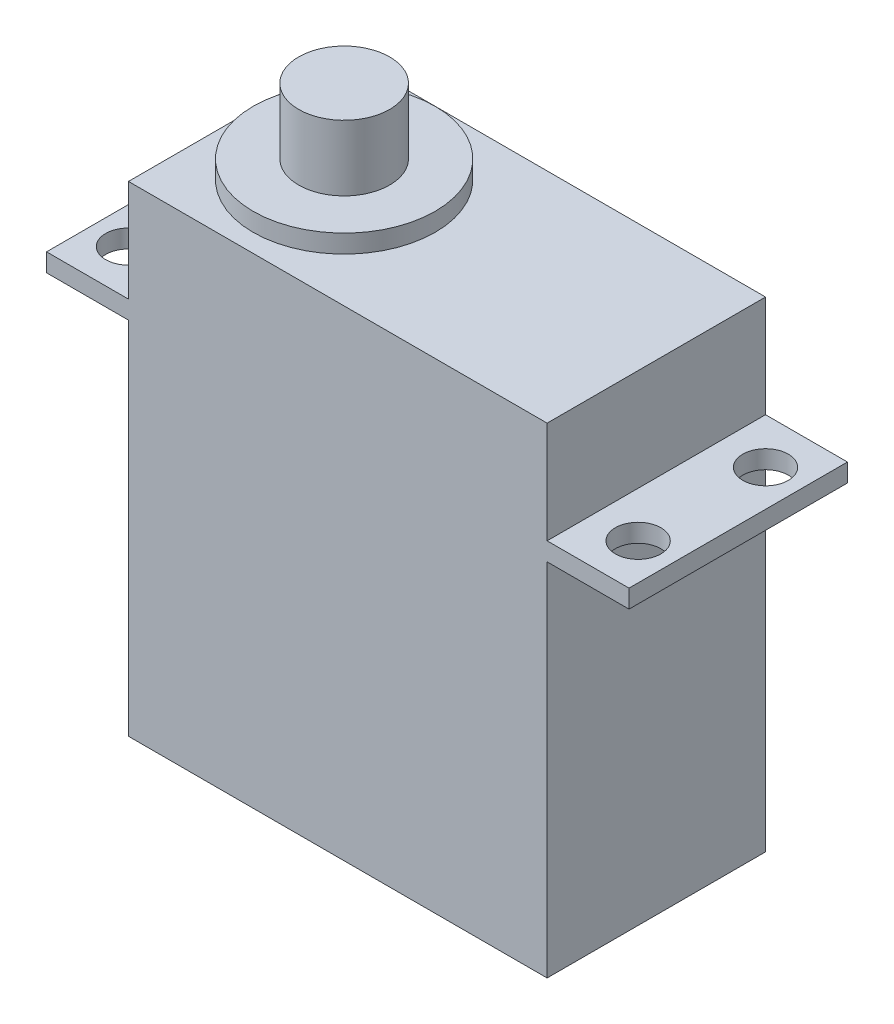
ISO-10303-21;
HEADER;
FILE_DESCRIPTION(('STEP AP214'),'2;1');
FILE_NAME('part.step','',(''),(''),'','','');
FILE_SCHEMA(('AUTOMOTIVE_DESIGN { 1 0 10303 214 1 1 1 1 }'));
ENDSEC;
DATA;
#1=APPLICATION_CONTEXT('core data for automotive mechanical design processes');
#2=APPLICATION_PROTOCOL_DEFINITION('international standard','automotive_design',2000,#1);
#3=PRODUCT_CONTEXT('',#1,'mechanical');
#4=PRODUCT('Part','Part','',(#3));
#5=PRODUCT_RELATED_PRODUCT_CATEGORY('part','',(#4));
#6=PRODUCT_DEFINITION_FORMATION('','',#4);
#7=PRODUCT_DEFINITION_CONTEXT('part definition',#1,'design');
#8=PRODUCT_DEFINITION('design','',#6,#7);
#9=PRODUCT_DEFINITION_SHAPE('','',#8);
#10=(LENGTH_UNIT() NAMED_UNIT(*) SI_UNIT(.MILLI.,.METRE.));
#11=(NAMED_UNIT(*) PLANE_ANGLE_UNIT() SI_UNIT($,.RADIAN.));
#12=(NAMED_UNIT(*) SI_UNIT($,.STERADIAN.) SOLID_ANGLE_UNIT());
#13=UNCERTAINTY_MEASURE_WITH_UNIT(LENGTH_MEASURE(1.E-05),#10,'distance_accuracy_value','');
#14=(GEOMETRIC_REPRESENTATION_CONTEXT(3) GLOBAL_UNCERTAINTY_ASSIGNED_CONTEXT((#13)) GLOBAL_UNIT_ASSIGNED_CONTEXT((#10,
#11,#12)) REPRESENTATION_CONTEXT('',''));
#15=CARTESIAN_POINT('',(0.,0.,0.));
#16=DIRECTION('',(0.,0.,1.));
#17=DIRECTION('',(1.,0.,0.));
#18=AXIS2_PLACEMENT_3D('',#15,#16,#17);
#19=CARTESIAN_POINT('',(-11.5,-19.8,0.));
#20=DIRECTION('',(1.,0.,0.));
#21=DIRECTION('',(0.,0.,-1.));
#22=AXIS2_PLACEMENT_3D('',#19,#20,#21);
#23=PLANE('',#22);
#24=DIRECTION('',(0.,0.,-1.));
#25=VECTOR('',#24,1.);
#26=CARTESIAN_POINT('',(-11.5,1.,0.));
#27=LINE('',#26,#25);
#28=CARTESIAN_POINT('',(-11.5,0.999999999999994,6.));
#29=VERTEX_POINT('',#28);
#30=CARTESIAN_POINT('',(-11.5,1.,-6.));
#31=VERTEX_POINT('',#30);
#32=EDGE_CURVE('E65',#29,#31,#27,.T.);
#33=ORIENTED_EDGE('',*,*,#32,.F.);
#34=DIRECTION('',(0.,1.,0.));
#35=VECTOR('',#34,1.);
#36=CARTESIAN_POINT('',(-11.5,-19.8,6.));
#37=LINE('',#36,#35);
#38=CARTESIAN_POINT('',(-11.5,6.6,6.));
#39=VERTEX_POINT('',#38);
#40=EDGE_CURVE('E232',#29,#39,#37,.T.);
#41=ORIENTED_EDGE('',*,*,#40,.T.);
#42=DIRECTION('',(0.,0.,-1.));
#43=VECTOR('',#42,1.);
#44=CARTESIAN_POINT('',(-11.5,6.6,0.));
#45=LINE('',#44,#43);
#46=CARTESIAN_POINT('',(-11.5,6.6,-6.));
#47=VERTEX_POINT('',#46);
#48=EDGE_CURVE('E131',#39,#47,#45,.T.);
#49=ORIENTED_EDGE('',*,*,#48,.T.);
#50=DIRECTION('',(0.,1.,0.));
#51=VECTOR('',#50,1.);
#52=CARTESIAN_POINT('',(-11.5,-19.8,-6.));
#53=LINE('',#52,#51);
#54=EDGE_CURVE('E50',#31,#47,#53,.T.);
#55=ORIENTED_EDGE('',*,*,#54,.F.);
#56=EDGE_LOOP('',(#33,#41,#49,#55));
#57=FACE_BOUND('',#56,.T.);
#58=ADVANCED_FACE('F41',(#57),#23,.F.);
#59=CARTESIAN_POINT('',(11.5,-19.8,0.));
#60=DIRECTION('',(1.,0.,0.));
#61=DIRECTION('',(0.,0.,-1.));
#62=AXIS2_PLACEMENT_3D('',#59,#60,#61);
#63=PLANE('',#62);
#64=DIRECTION('',(0.,1.,0.));
#65=VECTOR('',#64,1.);
#66=CARTESIAN_POINT('',(11.5,-19.8,6.));
#67=LINE('',#66,#65);
#68=CARTESIAN_POINT('',(11.5,1.,6.));
#69=VERTEX_POINT('',#68);
#70=CARTESIAN_POINT('',(11.5,6.6,6.));
#71=VERTEX_POINT('',#70);
#72=EDGE_CURVE('E239',#69,#71,#67,.T.);
#73=ORIENTED_EDGE('',*,*,#72,.F.);
#74=DIRECTION('',(0.,0.,-1.));
#75=VECTOR('',#74,1.);
#76=CARTESIAN_POINT('',(11.5,1.,0.));
#77=LINE('',#76,#75);
#78=CARTESIAN_POINT('',(11.5,0.999999999999994,-6.));
#79=VERTEX_POINT('',#78);
#80=EDGE_CURVE('E183',#69,#79,#77,.T.);
#81=ORIENTED_EDGE('',*,*,#80,.T.);
#82=DIRECTION('',(0.,1.,0.));
#83=VECTOR('',#82,1.);
#84=CARTESIAN_POINT('',(11.5,-19.8,-6.));
#85=LINE('',#84,#83);
#86=CARTESIAN_POINT('',(11.5,6.6,-6.));
#87=VERTEX_POINT('',#86);
#88=EDGE_CURVE('E236',#79,#87,#85,.T.);
#89=ORIENTED_EDGE('',*,*,#88,.T.);
#90=DIRECTION('',(0.,0.,-1.));
#91=VECTOR('',#90,1.);
#92=CARTESIAN_POINT('',(11.5,6.6,0.));
#93=LINE('',#92,#91);
#94=EDGE_CURVE('E217',#71,#87,#93,.T.);
#95=ORIENTED_EDGE('',*,*,#94,.F.);
#96=EDGE_LOOP('',(#73,#81,#89,#95));
#97=FACE_BOUND('',#96,.T.);
#98=ADVANCED_FACE('F251',(#97),#63,.T.);
#99=CARTESIAN_POINT('',(-11.5,-19.8,6.));
#100=VERTEX_POINT('',#99);
#101=CARTESIAN_POINT('',(-11.5,0.,6.));
#102=VERTEX_POINT('',#101);
#103=EDGE_CURVE('E240',#100,#102,#37,.T.);
#104=ORIENTED_EDGE('',*,*,#103,.T.);
#105=DIRECTION('',(0.,0.,-1.));
#106=VECTOR('',#105,1.);
#107=CARTESIAN_POINT('',(-11.5,0.,0.));
#108=LINE('',#107,#106);
#109=CARTESIAN_POINT('',(-11.5,0.,-6.));
#110=VERTEX_POINT('',#109);
#111=EDGE_CURVE('E58',#102,#110,#108,.T.);
#112=ORIENTED_EDGE('',*,*,#111,.T.);
#113=CARTESIAN_POINT('',(-11.5,-19.8,-6.));
#114=VERTEX_POINT('',#113);
#115=EDGE_CURVE('E11',#114,#110,#53,.T.);
#116=ORIENTED_EDGE('',*,*,#115,.F.);
#117=DIRECTION('',(0.,0.,-1.));
#118=VECTOR('',#117,1.);
#119=CARTESIAN_POINT('',(-11.5,-19.8,0.));
#120=LINE('',#119,#118);
#121=EDGE_CURVE('E222',#100,#114,#120,.T.);
#122=ORIENTED_EDGE('',*,*,#121,.F.);
#123=EDGE_LOOP('',(#104,#112,#116,#122));
#124=FACE_BOUND('',#123,.T.);
#125=ADVANCED_FACE('F43',(#124),#23,.F.);
#126=CARTESIAN_POINT('',(0.,-19.8,-6.));
#127=DIRECTION('',(0.,0.,1.));
#128=DIRECTION('',(1.,0.,0.));
#129=AXIS2_PLACEMENT_3D('',#126,#127,#128);
#130=PLANE('',#129);
#131=ORIENTED_EDGE('',*,*,#115,.T.);
#132=DIRECTION('',(1.,0.,0.));
#133=VECTOR('',#132,1.);
#134=CARTESIAN_POINT('',(0.,0.,-6.));
#135=LINE('',#134,#133);
#136=CARTESIAN_POINT('',(-16.,0.,-6.));
#137=VERTEX_POINT('',#136);
#138=EDGE_CURVE('E166',#137,#110,#135,.T.);
#139=ORIENTED_EDGE('',*,*,#138,.F.);
#140=DIRECTION('',(0.,-1.,0.));
#141=VECTOR('',#140,1.);
#142=CARTESIAN_POINT('',(-16.,1.,-6.));
#143=LINE('',#142,#141);
#144=CARTESIAN_POINT('',(-16.,1.,-6.));
#145=VERTEX_POINT('',#144);
#146=EDGE_CURVE('E147',#145,#137,#143,.T.);
#147=ORIENTED_EDGE('',*,*,#146,.F.);
#148=DIRECTION('',(1.,0.,0.));
#149=VECTOR('',#148,1.);
#150=CARTESIAN_POINT('',(0.,1.,-6.));
#151=LINE('',#150,#149);
#152=EDGE_CURVE('E141',#145,#31,#151,.T.);
#153=ORIENTED_EDGE('',*,*,#152,.T.);
#154=ORIENTED_EDGE('',*,*,#54,.T.);
#155=DIRECTION('',(1.,0.,0.));
#156=VECTOR('',#155,1.);
#157=CARTESIAN_POINT('',(0.,6.6,-6.));
#158=LINE('',#157,#156);
#159=EDGE_CURVE('E220',#47,#87,#158,.T.);
#160=ORIENTED_EDGE('',*,*,#159,.T.);
#161=ORIENTED_EDGE('',*,*,#88,.F.);
#162=DIRECTION('',(1.,0.,0.));
#163=VECTOR('',#162,1.);
#164=CARTESIAN_POINT('',(0.,1.,-6.));
#165=LINE('',#164,#163);
#166=CARTESIAN_POINT('',(16.,1.,-6.));
#167=VERTEX_POINT('',#166);
#168=EDGE_CURVE('E191',#79,#167,#165,.T.);
#169=ORIENTED_EDGE('',*,*,#168,.T.);
#170=DIRECTION('',(0.,-1.,0.));
#171=VECTOR('',#170,1.);
#172=CARTESIAN_POINT('',(16.,1.,-6.));
#173=LINE('',#172,#171);
#174=CARTESIAN_POINT('',(16.,0.,-6.));
#175=VERTEX_POINT('',#174);
#176=EDGE_CURVE('E194',#167,#175,#173,.T.);
#177=ORIENTED_EDGE('',*,*,#176,.T.);
#178=DIRECTION('',(1.,0.,0.));
#179=VECTOR('',#178,1.);
#180=CARTESIAN_POINT('',(0.,0.,-6.));
#181=LINE('',#180,#179);
#182=CARTESIAN_POINT('',(11.5,0.,-6.));
#183=VERTEX_POINT('',#182);
#184=EDGE_CURVE('E180',#183,#175,#181,.T.);
#185=ORIENTED_EDGE('',*,*,#184,.F.);
#186=CARTESIAN_POINT('',(11.5,-19.8,-6.));
#187=VERTEX_POINT('',#186);
#188=EDGE_CURVE('E136',#187,#183,#85,.T.);
#189=ORIENTED_EDGE('',*,*,#188,.F.);
#190=DIRECTION('',(1.,0.,0.));
#191=VECTOR('',#190,1.);
#192=CARTESIAN_POINT('',(0.,-19.8,-6.));
#193=LINE('',#192,#191);
#194=EDGE_CURVE('E231',#114,#187,#193,.T.);
#195=ORIENTED_EDGE('',*,*,#194,.F.);
#196=EDGE_LOOP('',(#131,#139,#147,#153,#154,#160,#161,#169,#177,#185,#189,#195));
#197=FACE_BOUND('',#196,.T.);
#198=ADVANCED_FACE('F145',(#197),#130,.F.);
#199=DIRECTION('',(0.,0.,-1.));
#200=VECTOR('',#199,1.);
#201=CARTESIAN_POINT('',(11.5,0.,0.));
#202=LINE('',#201,#200);
#203=CARTESIAN_POINT('',(11.5,0.,6.));
#204=VERTEX_POINT('',#203);
#205=EDGE_CURVE('E200',#204,#183,#202,.T.);
#206=ORIENTED_EDGE('',*,*,#205,.F.);
#207=CARTESIAN_POINT('',(11.5,-19.8,6.));
#208=VERTEX_POINT('',#207);
#209=EDGE_CURVE('E237',#208,#204,#67,.T.);
#210=ORIENTED_EDGE('',*,*,#209,.F.);
#211=DIRECTION('',(0.,0.,-1.));
#212=VECTOR('',#211,1.);
#213=CARTESIAN_POINT('',(11.5,-19.8,0.));
#214=LINE('',#213,#212);
#215=EDGE_CURVE('E228',#208,#187,#214,.T.);
#216=ORIENTED_EDGE('',*,*,#215,.T.);
#217=ORIENTED_EDGE('',*,*,#188,.T.);
#218=EDGE_LOOP('',(#206,#210,#216,#217));
#219=FACE_BOUND('',#218,.T.);
#220=ADVANCED_FACE('F265',(#219),#63,.T.);
#221=CARTESIAN_POINT('',(0.,-19.8,6.));
#222=DIRECTION('',(0.,0.,1.));
#223=DIRECTION('',(1.,0.,0.));
#224=AXIS2_PLACEMENT_3D('',#221,#222,#223);
#225=PLANE('',#224);
#226=ORIENTED_EDGE('',*,*,#209,.T.);
#227=DIRECTION('',(1.,0.,0.));
#228=VECTOR('',#227,1.);
#229=CARTESIAN_POINT('',(0.,0.,6.));
#230=LINE('',#229,#228);
#231=CARTESIAN_POINT('',(16.,0.,6.));
#232=VERTEX_POINT('',#231);
#233=EDGE_CURVE('E202',#204,#232,#230,.T.);
#234=ORIENTED_EDGE('',*,*,#233,.T.);
#235=DIRECTION('',(0.,-1.,0.));
#236=VECTOR('',#235,1.);
#237=CARTESIAN_POINT('',(16.,1.,6.));
#238=LINE('',#237,#236);
#239=CARTESIAN_POINT('',(16.,1.,6.));
#240=VERTEX_POINT('',#239);
#241=EDGE_CURVE('E211',#240,#232,#238,.T.);
#242=ORIENTED_EDGE('',*,*,#241,.F.);
#243=DIRECTION('',(1.,0.,0.));
#244=VECTOR('',#243,1.);
#245=CARTESIAN_POINT('',(0.,1.,6.));
#246=LINE('',#245,#244);
#247=EDGE_CURVE('E186',#69,#240,#246,.T.);
#248=ORIENTED_EDGE('',*,*,#247,.F.);
#249=ORIENTED_EDGE('',*,*,#72,.T.);
#250=DIRECTION('',(1.,0.,0.));
#251=VECTOR('',#250,1.);
#252=CARTESIAN_POINT('',(0.,6.6,6.));
#253=LINE('',#252,#251);
#254=EDGE_CURVE('E214',#39,#71,#253,.T.);
#255=ORIENTED_EDGE('',*,*,#254,.F.);
#256=ORIENTED_EDGE('',*,*,#40,.F.);
#257=DIRECTION('',(1.,0.,0.));
#258=VECTOR('',#257,1.);
#259=CARTESIAN_POINT('',(0.,1.,6.));
#260=LINE('',#259,#258);
#261=CARTESIAN_POINT('',(-16.,1.,6.));
#262=VERTEX_POINT('',#261);
#263=EDGE_CURVE('E143',#262,#29,#260,.T.);
#264=ORIENTED_EDGE('',*,*,#263,.F.);
#265=DIRECTION('',(0.,-1.,0.));
#266=VECTOR('',#265,1.);
#267=CARTESIAN_POINT('',(-16.,1.,6.));
#268=LINE('',#267,#266);
#269=CARTESIAN_POINT('',(-16.,0.,6.));
#270=VERTEX_POINT('',#269);
#271=EDGE_CURVE('E151',#262,#270,#268,.T.);
#272=ORIENTED_EDGE('',*,*,#271,.T.);
#273=DIRECTION('',(1.,0.,0.));
#274=VECTOR('',#273,1.);
#275=CARTESIAN_POINT('',(0.,0.,6.));
#276=LINE('',#275,#274);
#277=EDGE_CURVE('E162',#270,#102,#276,.T.);
#278=ORIENTED_EDGE('',*,*,#277,.T.);
#279=ORIENTED_EDGE('',*,*,#103,.F.);
#280=DIRECTION('',(1.,0.,0.));
#281=VECTOR('',#280,1.);
#282=CARTESIAN_POINT('',(0.,-19.8,6.));
#283=LINE('',#282,#281);
#284=EDGE_CURVE('E225',#100,#208,#283,.T.);
#285=ORIENTED_EDGE('',*,*,#284,.T.);
#286=EDGE_LOOP('',(#226,#234,#242,#248,#249,#255,#256,#264,#272,#278,#279,#285));
#287=FACE_BOUND('',#286,.T.);
#288=ADVANCED_FACE('F244',(#287),#225,.T.);
#289=CARTESIAN_POINT('',(0.,-19.8,0.));
#290=DIRECTION('',(0.,1.,0.));
#291=DIRECTION('',(0.,0.,1.));
#292=AXIS2_PLACEMENT_3D('',#289,#290,#291);
#293=PLANE('',#292);
#294=ORIENTED_EDGE('',*,*,#121,.T.);
#295=ORIENTED_EDGE('',*,*,#194,.T.);
#296=ORIENTED_EDGE('',*,*,#215,.F.);
#297=ORIENTED_EDGE('',*,*,#284,.F.);
#298=EDGE_LOOP('',(#294,#295,#296,#297));
#299=FACE_BOUND('',#298,.T.);
#300=ADVANCED_FACE('F269',(#299),#293,.F.);
#301=CARTESIAN_POINT('',(0.,6.6,0.));
#302=DIRECTION('',(0.,1.,0.));
#303=DIRECTION('',(0.,0.,1.));
#304=AXIS2_PLACEMENT_3D('',#301,#302,#303);
#305=PLANE('',#304);
#306=CARTESIAN_POINT('',(-5.65,6.6,0.));
#307=DIRECTION('',(0.,1.,0.));
#308=DIRECTION('',(0.,0.,1.));
#309=AXIS2_PLACEMENT_3D('',#306,#307,#308);
#310=CIRCLE('',#309,5.);
#311=CARTESIAN_POINT('',(-5.65,6.6,5.));
#312=VERTEX_POINT('',#311);
#313=EDGE_CURVE('E285',#312,#312,#310,.T.);
#314=ORIENTED_EDGE('',*,*,#313,.F.);
#315=EDGE_LOOP('',(#314));
#316=FACE_BOUND('',#315,.T.);
#317=ORIENTED_EDGE('',*,*,#48,.F.);
#318=ORIENTED_EDGE('',*,*,#254,.T.);
#319=ORIENTED_EDGE('',*,*,#94,.T.);
#320=ORIENTED_EDGE('',*,*,#159,.F.);
#321=EDGE_LOOP('',(#317,#318,#319,#320));
#322=FACE_BOUND('',#321,.T.);
#323=ADVANCED_FACE('F248',(#316,#322),#305,.T.);
#324=CARTESIAN_POINT('',(16.,1.,0.));
#325=DIRECTION('',(1.,0.,0.));
#326=DIRECTION('',(0.,0.,-1.));
#327=AXIS2_PLACEMENT_3D('',#324,#325,#326);
#328=PLANE('',#327);
#329=DIRECTION('',(0.,0.,1.));
#330=VECTOR('',#329,1.);
#331=CARTESIAN_POINT('',(16.,0.,0.));
#332=LINE('',#331,#330);
#333=EDGE_CURVE('E205',#175,#232,#332,.T.);
#334=ORIENTED_EDGE('',*,*,#333,.F.);
#335=ORIENTED_EDGE('',*,*,#176,.F.);
#336=DIRECTION('',(0.,0.,1.));
#337=VECTOR('',#336,1.);
#338=CARTESIAN_POINT('',(16.,1.,0.));
#339=LINE('',#338,#337);
#340=EDGE_CURVE('E188',#167,#240,#339,.T.);
#341=ORIENTED_EDGE('',*,*,#340,.T.);
#342=ORIENTED_EDGE('',*,*,#241,.T.);
#343=EDGE_LOOP('',(#334,#335,#341,#342));
#344=FACE_BOUND('',#343,.T.);
#345=ADVANCED_FACE('F259',(#344),#328,.T.);
#346=CARTESIAN_POINT('',(14.,1.,-3.5));
#347=DIRECTION('',(0.,-1.,0.));
#348=DIRECTION('',(0.,0.,-1.));
#349=AXIS2_PLACEMENT_3D('',#346,#347,#348);
#350=CYLINDRICAL_SURFACE('',#349,1.25);
#351=CARTESIAN_POINT('',(14.,1.,-3.5));
#352=DIRECTION('',(0.,1.,0.));
#353=DIRECTION('',(0.,0.,1.));
#354=AXIS2_PLACEMENT_3D('',#351,#352,#353);
#355=CIRCLE('',#354,1.25);
#356=CARTESIAN_POINT('',(14.,1.,-2.25));
#357=VERTEX_POINT('',#356);
#358=EDGE_CURVE('E179',#357,#357,#355,.T.);
#359=ORIENTED_EDGE('',*,*,#358,.T.);
#360=EDGE_LOOP('',(#359));
#361=FACE_BOUND('',#360,.T.);
#362=CARTESIAN_POINT('',(14.,0.,-3.5));
#363=DIRECTION('',(0.,1.,0.));
#364=DIRECTION('',(0.,0.,1.));
#365=AXIS2_PLACEMENT_3D('',#362,#363,#364);
#366=CIRCLE('',#365,1.25);
#367=CARTESIAN_POINT('',(14.,0.,-2.25));
#368=VERTEX_POINT('',#367);
#369=EDGE_CURVE('E197',#368,#368,#366,.T.);
#370=ORIENTED_EDGE('',*,*,#369,.F.);
#371=EDGE_LOOP('',(#370));
#372=FACE_BOUND('',#371,.T.);
#373=ADVANCED_FACE('F337',(#361,#372),#350,.F.);
#374=CARTESIAN_POINT('',(14.,1.,3.5));
#375=DIRECTION('',(0.,-1.,0.));
#376=DIRECTION('',(0.,0.,-1.));
#377=AXIS2_PLACEMENT_3D('',#374,#375,#376);
#378=CYLINDRICAL_SURFACE('',#377,1.25);
#379=CARTESIAN_POINT('',(14.,1.,3.5));
#380=DIRECTION('',(0.,1.,0.));
#381=DIRECTION('',(0.,0.,1.));
#382=AXIS2_PLACEMENT_3D('',#379,#380,#381);
#383=CIRCLE('',#382,1.25);
#384=CARTESIAN_POINT('',(14.,1.,4.74999999999999));
#385=VERTEX_POINT('',#384);
#386=EDGE_CURVE('E176',#385,#385,#383,.T.);
#387=ORIENTED_EDGE('',*,*,#386,.T.);
#388=EDGE_LOOP('',(#387));
#389=FACE_BOUND('',#388,.T.);
#390=CARTESIAN_POINT('',(14.,0.,3.5));
#391=DIRECTION('',(0.,1.,0.));
#392=DIRECTION('',(0.,0.,1.));
#393=AXIS2_PLACEMENT_3D('',#390,#391,#392);
#394=CIRCLE('',#393,1.25);
#395=CARTESIAN_POINT('',(14.,0.,4.74999999999999));
#396=VERTEX_POINT('',#395);
#397=EDGE_CURVE('E175',#396,#396,#394,.T.);
#398=ORIENTED_EDGE('',*,*,#397,.F.);
#399=EDGE_LOOP('',(#398));
#400=FACE_BOUND('',#399,.T.);
#401=ADVANCED_FACE('F341',(#389,#400),#378,.F.);
#402=CARTESIAN_POINT('',(0.,1.,0.));
#403=DIRECTION('',(0.,1.,0.));
#404=DIRECTION('',(0.,0.,1.));
#405=AXIS2_PLACEMENT_3D('',#402,#403,#404);
#406=PLANE('',#405);
#407=ORIENTED_EDGE('',*,*,#386,.F.);
#408=EDGE_LOOP('',(#407));
#409=FACE_BOUND('',#408,.T.);
#410=ORIENTED_EDGE('',*,*,#358,.F.);
#411=EDGE_LOOP('',(#410));
#412=FACE_BOUND('',#411,.T.);
#413=ORIENTED_EDGE('',*,*,#80,.F.);
#414=ORIENTED_EDGE('',*,*,#247,.T.);
#415=ORIENTED_EDGE('',*,*,#340,.F.);
#416=ORIENTED_EDGE('',*,*,#168,.F.);
#417=EDGE_LOOP('',(#413,#414,#415,#416));
#418=FACE_BOUND('',#417,.T.);
#419=ADVANCED_FACE('F254',(#409,#412,#418),#406,.T.);
#420=CARTESIAN_POINT('',(0.,0.,0.));
#421=DIRECTION('',(0.,1.,0.));
#422=DIRECTION('',(0.,0.,1.));
#423=AXIS2_PLACEMENT_3D('',#420,#421,#422);
#424=PLANE('',#423);
#425=ORIENTED_EDGE('',*,*,#397,.T.);
#426=EDGE_LOOP('',(#425));
#427=FACE_BOUND('',#426,.T.);
#428=ORIENTED_EDGE('',*,*,#369,.T.);
#429=EDGE_LOOP('',(#428));
#430=FACE_BOUND('',#429,.T.);
#431=ORIENTED_EDGE('',*,*,#205,.T.);
#432=ORIENTED_EDGE('',*,*,#184,.T.);
#433=ORIENTED_EDGE('',*,*,#333,.T.);
#434=ORIENTED_EDGE('',*,*,#233,.F.);
#435=EDGE_LOOP('',(#431,#432,#433,#434));
#436=FACE_BOUND('',#435,.T.);
#437=ADVANCED_FACE('F348',(#427,#430,#436),#424,.F.);
#438=CARTESIAN_POINT('',(-14.,1.,-3.5));
#439=DIRECTION('',(0.,-1.,0.));
#440=DIRECTION('',(0.,0.,-1.));
#441=AXIS2_PLACEMENT_3D('',#438,#439,#440);
#442=CYLINDRICAL_SURFACE('',#441,1.25);
#443=CARTESIAN_POINT('',(-14.,1.,-3.5));
#444=DIRECTION('',(0.,1.,0.));
#445=DIRECTION('',(0.,0.,1.));
#446=AXIS2_PLACEMENT_3D('',#443,#444,#445);
#447=CIRCLE('',#446,1.25);
#448=CARTESIAN_POINT('',(-14.,1.,-2.25));
#449=VERTEX_POINT('',#448);
#450=EDGE_CURVE('E277',#449,#449,#447,.T.);
#451=ORIENTED_EDGE('',*,*,#450,.T.);
#452=EDGE_LOOP('',(#451));
#453=FACE_BOUND('',#452,.T.);
#454=CARTESIAN_POINT('',(-14.,0.,-3.5));
#455=DIRECTION('',(0.,1.,0.));
#456=DIRECTION('',(0.,0.,1.));
#457=AXIS2_PLACEMENT_3D('',#454,#455,#456);
#458=CIRCLE('',#457,1.25);
#459=CARTESIAN_POINT('',(-14.,0.,-2.25));
#460=VERTEX_POINT('',#459);
#461=EDGE_CURVE('E158',#460,#460,#458,.T.);
#462=ORIENTED_EDGE('',*,*,#461,.F.);
#463=EDGE_LOOP('',(#462));
#464=FACE_BOUND('',#463,.T.);
#465=ADVANCED_FACE('F351',(#453,#464),#442,.F.);
#466=CARTESIAN_POINT('',(-14.,1.,3.5));
#467=DIRECTION('',(0.,-1.,0.));
#468=DIRECTION('',(0.,0.,-1.));
#469=AXIS2_PLACEMENT_3D('',#466,#467,#468);
#470=CYLINDRICAL_SURFACE('',#469,1.25);
#471=CARTESIAN_POINT('',(-14.,1.,3.5));
#472=DIRECTION('',(0.,1.,0.));
#473=DIRECTION('',(0.,0.,1.));
#474=AXIS2_PLACEMENT_3D('',#471,#472,#473);
#475=CIRCLE('',#474,1.25);
#476=CARTESIAN_POINT('',(-14.,1.,4.75));
#477=VERTEX_POINT('',#476);
#478=EDGE_CURVE('E171',#477,#477,#475,.T.);
#479=ORIENTED_EDGE('',*,*,#478,.T.);
#480=EDGE_LOOP('',(#479));
#481=FACE_BOUND('',#480,.T.);
#482=CARTESIAN_POINT('',(-14.,0.,3.5));
#483=DIRECTION('',(0.,1.,0.));
#484=DIRECTION('',(0.,0.,1.));
#485=AXIS2_PLACEMENT_3D('',#482,#483,#484);
#486=CIRCLE('',#485,1.25);
#487=CARTESIAN_POINT('',(-14.,0.,4.75));
#488=VERTEX_POINT('',#487);
#489=EDGE_CURVE('E155',#488,#488,#486,.T.);
#490=ORIENTED_EDGE('',*,*,#489,.F.);
#491=EDGE_LOOP('',(#490));
#492=FACE_BOUND('',#491,.T.);
#493=ADVANCED_FACE('F356',(#481,#492),#470,.F.);
#494=CARTESIAN_POINT('',(-16.,1.,0.));
#495=DIRECTION('',(1.,0.,0.));
#496=DIRECTION('',(0.,0.,-1.));
#497=AXIS2_PLACEMENT_3D('',#494,#495,#496);
#498=PLANE('',#497);
#499=DIRECTION('',(0.,0.,1.));
#500=VECTOR('',#499,1.);
#501=CARTESIAN_POINT('',(-16.,0.,0.));
#502=LINE('',#501,#500);
#503=EDGE_CURVE('E169',#137,#270,#502,.T.);
#504=ORIENTED_EDGE('',*,*,#503,.T.);
#505=ORIENTED_EDGE('',*,*,#271,.F.);
#506=DIRECTION('',(0.,0.,1.));
#507=VECTOR('',#506,1.);
#508=CARTESIAN_POINT('',(-16.,1.,0.));
#509=LINE('',#508,#507);
#510=EDGE_CURVE('E149',#145,#262,#509,.T.);
#511=ORIENTED_EDGE('',*,*,#510,.F.);
#512=ORIENTED_EDGE('',*,*,#146,.T.);
#513=EDGE_LOOP('',(#504,#505,#511,#512));
#514=FACE_BOUND('',#513,.T.);
#515=ADVANCED_FACE('F276',(#514),#498,.F.);
#516=CARTESIAN_POINT('',(0.,1.,0.));
#517=DIRECTION('',(0.,1.,0.));
#518=DIRECTION('',(0.,0.,1.));
#519=AXIS2_PLACEMENT_3D('',#516,#517,#518);
#520=PLANE('',#519);
#521=ORIENTED_EDGE('',*,*,#478,.F.);
#522=EDGE_LOOP('',(#521));
#523=FACE_BOUND('',#522,.T.);
#524=ORIENTED_EDGE('',*,*,#450,.F.);
#525=EDGE_LOOP('',(#524));
#526=FACE_BOUND('',#525,.T.);
#527=ORIENTED_EDGE('',*,*,#263,.T.);
#528=ORIENTED_EDGE('',*,*,#32,.T.);
#529=ORIENTED_EDGE('',*,*,#152,.F.);
#530=ORIENTED_EDGE('',*,*,#510,.T.);
#531=EDGE_LOOP('',(#527,#528,#529,#530));
#532=FACE_BOUND('',#531,.T.);
#533=ADVANCED_FACE('F140',(#523,#526,#532),#520,.T.);
#534=CARTESIAN_POINT('',(0.,0.,0.));
#535=DIRECTION('',(0.,1.,0.));
#536=DIRECTION('',(0.,0.,1.));
#537=AXIS2_PLACEMENT_3D('',#534,#535,#536);
#538=PLANE('',#537);
#539=ORIENTED_EDGE('',*,*,#489,.T.);
#540=EDGE_LOOP('',(#539));
#541=FACE_BOUND('',#540,.T.);
#542=ORIENTED_EDGE('',*,*,#461,.T.);
#543=EDGE_LOOP('',(#542));
#544=FACE_BOUND('',#543,.T.);
#545=ORIENTED_EDGE('',*,*,#277,.F.);
#546=ORIENTED_EDGE('',*,*,#503,.F.);
#547=ORIENTED_EDGE('',*,*,#138,.T.);
#548=ORIENTED_EDGE('',*,*,#111,.F.);
#549=EDGE_LOOP('',(#545,#546,#547,#548));
#550=FACE_BOUND('',#549,.T.);
#551=ADVANCED_FACE('F273',(#541,#544,#550),#538,.F.);
#552=CARTESIAN_POINT('',(-5.65,7.6,0.));
#553=DIRECTION('',(0.,-1.,0.));
#554=DIRECTION('',(0.,0.,-1.));
#555=AXIS2_PLACEMENT_3D('',#552,#553,#554);
#556=CYLINDRICAL_SURFACE('',#555,5.);
#557=CARTESIAN_POINT('',(-5.65,7.6,0.));
#558=DIRECTION('',(0.,1.,0.));
#559=DIRECTION('',(0.,0.,1.));
#560=AXIS2_PLACEMENT_3D('',#557,#558,#559);
#561=CIRCLE('',#560,5.);
#562=CARTESIAN_POINT('',(-5.65,7.6,5.));
#563=VERTEX_POINT('',#562);
#564=EDGE_CURVE('E288',#563,#563,#561,.T.);
#565=ORIENTED_EDGE('',*,*,#564,.F.);
#566=EDGE_LOOP('',(#565));
#567=FACE_BOUND('',#566,.T.);
#568=ORIENTED_EDGE('',*,*,#313,.T.);
#569=EDGE_LOOP('',(#568));
#570=FACE_BOUND('',#569,.T.);
#571=ADVANCED_FACE('F301',(#567,#570),#556,.T.);
#572=CARTESIAN_POINT('',(-5.65,7.6,0.));
#573=DIRECTION('',(0.,1.,0.));
#574=DIRECTION('',(0.,0.,1.));
#575=AXIS2_PLACEMENT_3D('',#572,#573,#574);
#576=PLANE('',#575);
#577=CARTESIAN_POINT('',(-5.65,7.6,0.));
#578=DIRECTION('',(0.,1.,0.));
#579=DIRECTION('',(0.,0.,1.));
#580=AXIS2_PLACEMENT_3D('',#577,#578,#579);
#581=CIRCLE('',#580,2.5);
#582=CARTESIAN_POINT('',(-5.65,7.6,2.5));
#583=VERTEX_POINT('',#582);
#584=EDGE_CURVE('E45',#583,#583,#581,.T.);
#585=ORIENTED_EDGE('',*,*,#584,.F.);
#586=EDGE_LOOP('',(#585));
#587=FACE_BOUND('',#586,.T.);
#588=ORIENTED_EDGE('',*,*,#564,.T.);
#589=EDGE_LOOP('',(#588));
#590=FACE_BOUND('',#589,.T.);
#591=ADVANCED_FACE('F298',(#587,#590),#576,.T.);
#592=CARTESIAN_POINT('',(-5.65,11.2,0.));
#593=DIRECTION('',(0.,1.,0.));
#594=DIRECTION('',(0.,0.,1.));
#595=AXIS2_PLACEMENT_3D('',#592,#593,#594);
#596=PLANE('',#595);
#597=CARTESIAN_POINT('',(-5.65,11.2,0.));
#598=DIRECTION('',(0.,1.,0.));
#599=DIRECTION('',(0.,0.,1.));
#600=AXIS2_PLACEMENT_3D('',#597,#598,#599);
#601=CIRCLE('',#600,2.5);
#602=CARTESIAN_POINT('',(-5.65,11.2,2.5));
#603=VERTEX_POINT('',#602);
#604=EDGE_CURVE('E159',#603,#603,#601,.T.);
#605=ORIENTED_EDGE('',*,*,#604,.T.);
#606=EDGE_LOOP('',(#605));
#607=FACE_BOUND('',#606,.T.);
#608=ADVANCED_FACE('F300',(#607),#596,.T.);
#609=CARTESIAN_POINT('',(-5.65,11.2,0.));
#610=DIRECTION('',(0.,-1.,0.));
#611=DIRECTION('',(0.,0.,-1.));
#612=AXIS2_PLACEMENT_3D('',#609,#610,#611);
#613=CYLINDRICAL_SURFACE('',#612,2.5);
#614=ORIENTED_EDGE('',*,*,#584,.T.);
#615=EDGE_LOOP('',(#614));
#616=FACE_BOUND('',#615,.T.);
#617=ORIENTED_EDGE('',*,*,#604,.F.);
#618=EDGE_LOOP('',(#617));
#619=FACE_BOUND('',#618,.T.);
#620=ADVANCED_FACE('F295',(#616,#619),#613,.T.);
#621=CLOSED_SHELL('',(#58,#98,#125,#198,#220,#288,#300,#323,#345,#373,#401,#419,#437,#465,#493,
#515,#533,#551,#571,#591,#608,#620));
#622=MANIFOLD_SOLID_BREP('B2',#621);
#623=ADVANCED_BREP_SHAPE_REPRESENTATION('',(#18,#622),#14);
#624=SHAPE_DEFINITION_REPRESENTATION(#9,#623);
ENDSEC;
END-ISO-10303-21;
